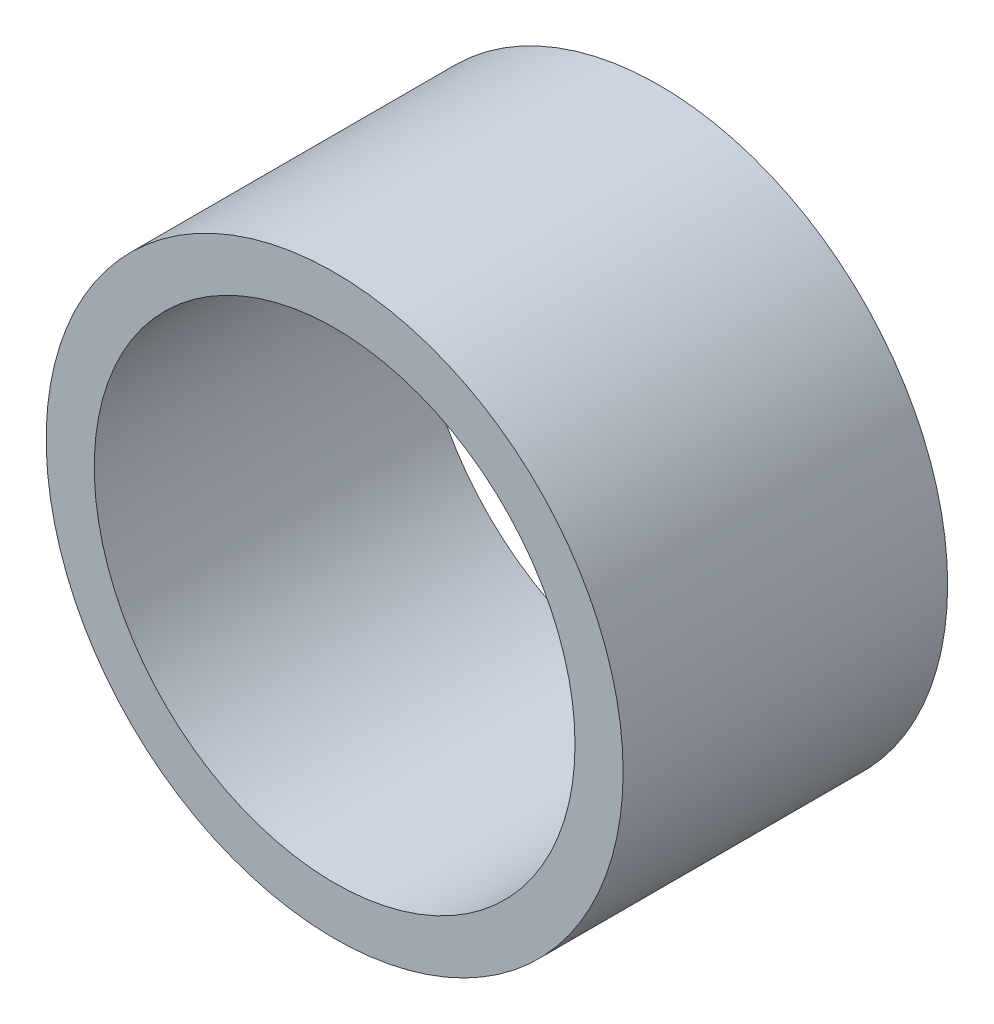
ISO-10303-21;
HEADER;
FILE_DESCRIPTION(('STEP AP214'),'2;1');
FILE_NAME('part.step','',(''),(''),'','','');
FILE_SCHEMA(('AUTOMOTIVE_DESIGN { 1 0 10303 214 1 1 1 1 }'));
ENDSEC;
DATA;
#1=APPLICATION_CONTEXT('core data for automotive mechanical design processes');
#2=APPLICATION_PROTOCOL_DEFINITION('international standard','automotive_design',2000,#1);
#3=PRODUCT_CONTEXT('',#1,'mechanical');
#4=PRODUCT('Part','Part','',(#3));
#5=PRODUCT_RELATED_PRODUCT_CATEGORY('part','',(#4));
#6=PRODUCT_DEFINITION_FORMATION('','',#4);
#7=PRODUCT_DEFINITION_CONTEXT('part definition',#1,'design');
#8=PRODUCT_DEFINITION('design','',#6,#7);
#9=PRODUCT_DEFINITION_SHAPE('','',#8);
#10=(LENGTH_UNIT() NAMED_UNIT(*) SI_UNIT(.MILLI.,.METRE.));
#11=(NAMED_UNIT(*) PLANE_ANGLE_UNIT() SI_UNIT($,.RADIAN.));
#12=(NAMED_UNIT(*) SI_UNIT($,.STERADIAN.) SOLID_ANGLE_UNIT());
#13=UNCERTAINTY_MEASURE_WITH_UNIT(LENGTH_MEASURE(1.E-05),#10,'distance_accuracy_value','');
#14=(GEOMETRIC_REPRESENTATION_CONTEXT(3) GLOBAL_UNCERTAINTY_ASSIGNED_CONTEXT((#13)) GLOBAL_UNIT_ASSIGNED_CONTEXT((#10,
#11,#12)) REPRESENTATION_CONTEXT('',''));
#15=CARTESIAN_POINT('',(0.,0.,0.));
#16=DIRECTION('',(0.,0.,1.));
#17=DIRECTION('',(1.,0.,0.));
#18=AXIS2_PLACEMENT_3D('',#15,#16,#17);
#19=CARTESIAN_POINT('',(0.,0.,6.75));
#20=DIRECTION('',(0.,0.,1.));
#21=DIRECTION('',(1.,0.,0.));
#22=AXIS2_PLACEMENT_3D('',#19,#20,#21);
#23=PLANE('',#22);
#24=CARTESIAN_POINT('',(0.,0.,6.75));
#25=DIRECTION('',(0.,0.,1.));
#26=DIRECTION('',(1.,0.,0.));
#27=AXIS2_PLACEMENT_3D('',#24,#25,#26);
#28=CIRCLE('',#27,6.);
#29=CARTESIAN_POINT('',(6.,0.,6.75));
#30=VERTEX_POINT('',#29);
#31=EDGE_CURVE('E11',#30,#30,#28,.T.);
#32=ORIENTED_EDGE('',*,*,#31,.T.);
#33=EDGE_LOOP('',(#32));
#34=FACE_BOUND('',#33,.T.);
#35=CARTESIAN_POINT('',(0.,0.,6.75));
#36=DIRECTION('',(0.,0.,1.));
#37=DIRECTION('',(1.,0.,0.));
#38=AXIS2_PLACEMENT_3D('',#35,#36,#37);
#39=CIRCLE('',#38,5.);
#40=CARTESIAN_POINT('',(5.,0.,6.75));
#41=VERTEX_POINT('',#40);
#42=EDGE_CURVE('E54',#41,#41,#39,.T.);
#43=ORIENTED_EDGE('',*,*,#42,.F.);
#44=EDGE_LOOP('',(#43));
#45=FACE_BOUND('',#44,.T.);
#46=ADVANCED_FACE('F43',(#34,#45),#23,.T.);
#47=CARTESIAN_POINT('',(0.,0.,0.));
#48=DIRECTION('',(0.,0.,1.));
#49=DIRECTION('',(1.,0.,0.));
#50=AXIS2_PLACEMENT_3D('',#47,#48,#49);
#51=PLANE('',#50);
#52=CARTESIAN_POINT('',(0.,0.,0.));
#53=DIRECTION('',(0.,0.,1.));
#54=DIRECTION('',(1.,0.,0.));
#55=AXIS2_PLACEMENT_3D('',#52,#53,#54);
#56=CIRCLE('',#55,6.);
#57=CARTESIAN_POINT('',(6.,0.,0.));
#58=VERTEX_POINT('',#57);
#59=EDGE_CURVE('E47',#58,#58,#56,.T.);
#60=ORIENTED_EDGE('',*,*,#59,.F.);
#61=EDGE_LOOP('',(#60));
#62=FACE_BOUND('',#61,.T.);
#63=CARTESIAN_POINT('',(0.,0.,0.));
#64=DIRECTION('',(0.,0.,1.));
#65=DIRECTION('',(1.,0.,0.));
#66=AXIS2_PLACEMENT_3D('',#63,#64,#65);
#67=CIRCLE('',#66,5.);
#68=CARTESIAN_POINT('',(5.,0.,0.));
#69=VERTEX_POINT('',#68);
#70=EDGE_CURVE('E56',#69,#69,#67,.T.);
#71=ORIENTED_EDGE('',*,*,#70,.T.);
#72=EDGE_LOOP('',(#71));
#73=FACE_BOUND('',#72,.T.);
#74=ADVANCED_FACE('F66',(#62,#73),#51,.F.);
#75=CARTESIAN_POINT('',(0.,0.,6.75));
#76=DIRECTION('',(0.,0.,-1.));
#77=DIRECTION('',(-1.,0.,0.));
#78=AXIS2_PLACEMENT_3D('',#75,#76,#77);
#79=CYLINDRICAL_SURFACE('',#78,6.);
#80=ORIENTED_EDGE('',*,*,#31,.F.);
#81=EDGE_LOOP('',(#80));
#82=FACE_BOUND('',#81,.T.);
#83=ORIENTED_EDGE('',*,*,#59,.T.);
#84=EDGE_LOOP('',(#83));
#85=FACE_BOUND('',#84,.T.);
#86=ADVANCED_FACE('F45',(#82,#85),#79,.T.);
#87=CARTESIAN_POINT('',(0.,0.,6.75));
#88=DIRECTION('',(0.,0.,-1.));
#89=DIRECTION('',(-1.,0.,0.));
#90=AXIS2_PLACEMENT_3D('',#87,#88,#89);
#91=CYLINDRICAL_SURFACE('',#90,5.);
#92=ORIENTED_EDGE('',*,*,#42,.T.);
#93=EDGE_LOOP('',(#92));
#94=FACE_BOUND('',#93,.T.);
#95=ORIENTED_EDGE('',*,*,#70,.F.);
#96=EDGE_LOOP('',(#95));
#97=FACE_BOUND('',#96,.T.);
#98=ADVANCED_FACE('F62',(#94,#97),#91,.F.);
#99=CLOSED_SHELL('',(#46,#74,#86,#98));
#100=MANIFOLD_SOLID_BREP('B2',#99);
#101=ADVANCED_BREP_SHAPE_REPRESENTATION('',(#18,#100),#14);
#102=SHAPE_DEFINITION_REPRESENTATION(#9,#101);
ENDSEC;
END-ISO-10303-21;
